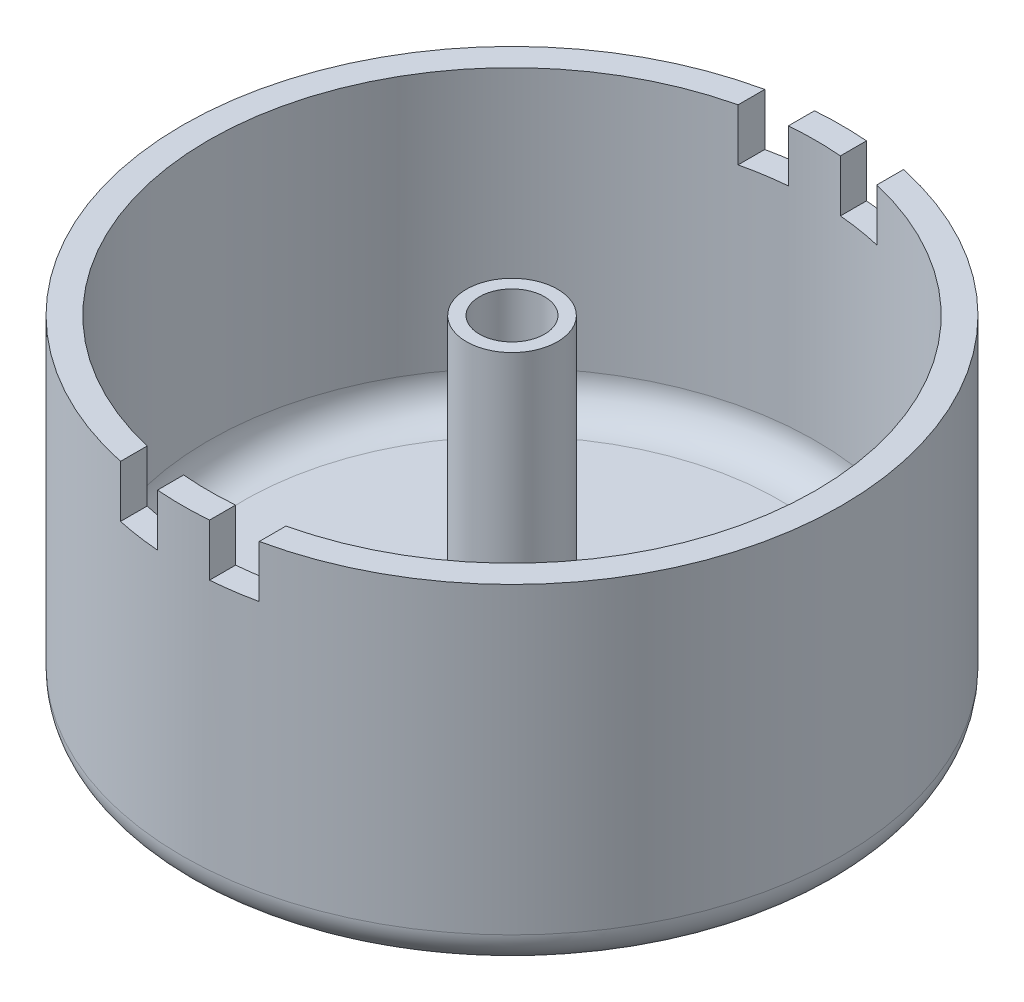
ISO-10303-21;
HEADER;
FILE_DESCRIPTION(('STEP AP214'),'2;1');
FILE_NAME('part.step','',(''),(''),'','','');
FILE_SCHEMA(('AUTOMOTIVE_DESIGN { 1 0 10303 214 1 1 1 1 }'));
ENDSEC;
DATA;
#1=APPLICATION_CONTEXT('core data for automotive mechanical design processes');
#2=APPLICATION_PROTOCOL_DEFINITION('international standard','automotive_design',2000,#1);
#3=PRODUCT_CONTEXT('',#1,'mechanical');
#4=PRODUCT('Part','Part','',(#3));
#5=PRODUCT_RELATED_PRODUCT_CATEGORY('part','',(#4));
#6=PRODUCT_DEFINITION_FORMATION('','',#4);
#7=PRODUCT_DEFINITION_CONTEXT('part definition',#1,'design');
#8=PRODUCT_DEFINITION('design','',#6,#7);
#9=PRODUCT_DEFINITION_SHAPE('','',#8);
#10=(LENGTH_UNIT() NAMED_UNIT(*) SI_UNIT(.MILLI.,.METRE.));
#11=(NAMED_UNIT(*) PLANE_ANGLE_UNIT() SI_UNIT($,.RADIAN.));
#12=(NAMED_UNIT(*) SI_UNIT($,.STERADIAN.) SOLID_ANGLE_UNIT());
#13=UNCERTAINTY_MEASURE_WITH_UNIT(LENGTH_MEASURE(1.E-05),#10,'distance_accuracy_value','');
#14=(GEOMETRIC_REPRESENTATION_CONTEXT(3) GLOBAL_UNCERTAINTY_ASSIGNED_CONTEXT((#13)) GLOBAL_UNIT_ASSIGNED_CONTEXT((#10,
#11,#12)) REPRESENTATION_CONTEXT('',''));
#15=CARTESIAN_POINT('',(0.,0.,0.));
#16=DIRECTION('',(0.,0.,1.));
#17=DIRECTION('',(1.,0.,0.));
#18=AXIS2_PLACEMENT_3D('',#15,#16,#17);
#19=CARTESIAN_POINT('',(0.,19.5,0.));
#20=DIRECTION('',(0.,1.,0.));
#21=DIRECTION('',(0.,0.,1.));
#22=AXIS2_PLACEMENT_3D('',#19,#20,#21);
#23=PLANE('',#22);
#24=CARTESIAN_POINT('',(0.,19.5,0.));
#25=DIRECTION('',(0.,1.,0.));
#26=DIRECTION('',(0.,0.,1.));
#27=AXIS2_PLACEMENT_3D('',#24,#25,#26);
#28=CIRCLE('',#27,17.5);
#29=CARTESIAN_POINT('',(-1.5,19.5,17.4355957741627));
#30=VERTEX_POINT('',#29);
#31=CARTESIAN_POINT('',(1.5,19.5,17.4355957741627));
#32=VERTEX_POINT('',#31);
#33=EDGE_CURVE('E287',#30,#32,#28,.T.);
#34=ORIENTED_EDGE('',*,*,#33,.F.);
#35=DIRECTION('',(0.,0.,1.));
#36=VECTOR('',#35,1.);
#37=CARTESIAN_POINT('',(-1.5,19.5,22.5));
#38=LINE('',#37,#36);
#39=CARTESIAN_POINT('',(-1.5,19.5,18.9406969248758));
#40=VERTEX_POINT('',#39);
#41=EDGE_CURVE('E176',#30,#40,#38,.T.);
#42=ORIENTED_EDGE('',*,*,#41,.T.);
#43=CARTESIAN_POINT('',(0.,19.5,0.));
#44=DIRECTION('',(0.,1.,0.));
#45=DIRECTION('',(0.,0.,1.));
#46=AXIS2_PLACEMENT_3D('',#43,#44,#45);
#47=CIRCLE('',#46,19.);
#48=CARTESIAN_POINT('',(1.5,19.5,18.9406969248758));
#49=VERTEX_POINT('',#48);
#50=EDGE_CURVE('E292',#40,#49,#47,.T.);
#51=ORIENTED_EDGE('',*,*,#50,.T.);
#52=DIRECTION('',(0.,0.,-1.));
#53=VECTOR('',#52,1.);
#54=CARTESIAN_POINT('',(1.5,19.5,17.4355957741627));
#55=LINE('',#54,#53);
#56=EDGE_CURVE('E191',#49,#32,#55,.T.);
#57=ORIENTED_EDGE('',*,*,#56,.T.);
#58=EDGE_LOOP('',(#34,#42,#51,#57));
#59=FACE_BOUND('',#58,.T.);
#60=ADVANCED_FACE('F45',(#59),#23,.T.);
#61=CARTESIAN_POINT('',(-4.,19.5,-18.5741756210067));
#62=VERTEX_POINT('',#61);
#63=CARTESIAN_POINT('',(-4.,19.5,18.5741756210067));
#64=VERTEX_POINT('',#63);
#65=EDGE_CURVE('E288',#62,#64,#47,.T.);
#66=ORIENTED_EDGE('',*,*,#65,.T.);
#67=DIRECTION('',(0.,0.,-1.));
#68=VECTOR('',#67,1.);
#69=CARTESIAN_POINT('',(-4.,19.5,17.0367250374008));
#70=LINE('',#69,#68);
#71=CARTESIAN_POINT('',(-4.,19.5,17.0367250374008));
#72=VERTEX_POINT('',#71);
#73=EDGE_CURVE('E204',#64,#72,#70,.T.);
#74=ORIENTED_EDGE('',*,*,#73,.T.);
#75=CARTESIAN_POINT('',(-4.,19.5,-17.0367250374008));
#76=VERTEX_POINT('',#75);
#77=EDGE_CURVE('E182',#76,#72,#28,.T.);
#78=ORIENTED_EDGE('',*,*,#77,.F.);
#79=DIRECTION('',(0.,0.,1.));
#80=VECTOR('',#79,1.);
#81=CARTESIAN_POINT('',(-4.,19.5,-17.0367250374008));
#82=LINE('',#81,#80);
#83=EDGE_CURVE('E223',#62,#76,#82,.T.);
#84=ORIENTED_EDGE('',*,*,#83,.F.);
#85=EDGE_LOOP('',(#66,#74,#78,#84));
#86=FACE_BOUND('',#85,.T.);
#87=ADVANCED_FACE('F337',(#86),#23,.T.);
#88=CARTESIAN_POINT('',(4.,19.5,17.0367250374008));
#89=VERTEX_POINT('',#88);
#90=CARTESIAN_POINT('',(4.,19.5,-17.0367250374008));
#91=VERTEX_POINT('',#90);
#92=EDGE_CURVE('E281',#89,#91,#28,.T.);
#93=ORIENTED_EDGE('',*,*,#92,.F.);
#94=DIRECTION('',(0.,0.,1.));
#95=VECTOR('',#94,1.);
#96=CARTESIAN_POINT('',(4.,19.5,22.5));
#97=LINE('',#96,#95);
#98=CARTESIAN_POINT('',(4.,19.5,18.5741756210067));
#99=VERTEX_POINT('',#98);
#100=EDGE_CURVE('E197',#89,#99,#97,.T.);
#101=ORIENTED_EDGE('',*,*,#100,.T.);
#102=CARTESIAN_POINT('',(4.,19.5,-18.5741756210067));
#103=VERTEX_POINT('',#102);
#104=EDGE_CURVE('E293',#99,#103,#47,.T.);
#105=ORIENTED_EDGE('',*,*,#104,.T.);
#106=DIRECTION('',(0.,0.,-1.));
#107=VECTOR('',#106,1.);
#108=CARTESIAN_POINT('',(4.,19.5,-22.5));
#109=LINE('',#108,#107);
#110=EDGE_CURVE('E242',#91,#103,#109,.T.);
#111=ORIENTED_EDGE('',*,*,#110,.F.);
#112=EDGE_LOOP('',(#93,#101,#105,#111));
#113=FACE_BOUND('',#112,.T.);
#114=ADVANCED_FACE('F344',(#113),#23,.T.);
#115=CARTESIAN_POINT('',(0.,2.5,0.));
#116=DIRECTION('',(0.,-1.,0.));
#117=DIRECTION('',(0.,0.,-1.));
#118=AXIS2_PLACEMENT_3D('',#115,#116,#117);
#119=CYLINDRICAL_SURFACE('',#118,19.);
#120=CARTESIAN_POINT('',(0.,2.,0.));
#121=DIRECTION('',(0.,1.,0.));
#122=DIRECTION('',(0.,0.,1.));
#123=AXIS2_PLACEMENT_3D('',#120,#121,#122);
#124=CIRCLE('',#123,19.);
#125=CARTESIAN_POINT('',(0.,2.,19.));
#126=VERTEX_POINT('',#125);
#127=EDGE_CURVE('E294',#126,#126,#124,.T.);
#128=ORIENTED_EDGE('',*,*,#127,.T.);
#129=EDGE_LOOP('',(#128));
#130=FACE_BOUND('',#129,.T.);
#131=DIRECTION('',(0.,-1.,0.));
#132=VECTOR('',#131,1.);
#133=CARTESIAN_POINT('',(-1.5,2.5,18.9406969248758));
#134=LINE('',#133,#132);
#135=CARTESIAN_POINT('',(-1.5,16.5,18.9406969248758));
#136=VERTEX_POINT('',#135);
#137=EDGE_CURVE('E216',#136,#40,#134,.F.);
#138=ORIENTED_EDGE('',*,*,#137,.F.);
#139=CARTESIAN_POINT('',(0.,16.5,0.));
#140=DIRECTION('',(0.,-1.,0.));
#141=DIRECTION('',(0.,0.,-1.));
#142=AXIS2_PLACEMENT_3D('',#139,#140,#141);
#143=CIRCLE('',#142,19.);
#144=CARTESIAN_POINT('',(-4.,16.5,18.5741756210067));
#145=VERTEX_POINT('',#144);
#146=EDGE_CURVE('E213',#136,#145,#143,.T.);
#147=ORIENTED_EDGE('',*,*,#146,.T.);
#148=DIRECTION('',(0.,-1.,0.));
#149=VECTOR('',#148,1.);
#150=CARTESIAN_POINT('',(-4.,2.5,18.5741756210067));
#151=LINE('',#150,#149);
#152=EDGE_CURVE('E167',#64,#145,#151,.T.);
#153=ORIENTED_EDGE('',*,*,#152,.F.);
#154=ORIENTED_EDGE('',*,*,#65,.F.);
#155=DIRECTION('',(0.,-1.,0.));
#156=VECTOR('',#155,1.);
#157=CARTESIAN_POINT('',(-4.,2.5,-18.5741756210067));
#158=LINE('',#157,#156);
#159=CARTESIAN_POINT('',(-4.,16.5,-18.5741756210067));
#160=VERTEX_POINT('',#159);
#161=EDGE_CURVE('E269',#62,#160,#158,.T.);
#162=ORIENTED_EDGE('',*,*,#161,.T.);
#163=CARTESIAN_POINT('',(0.,16.5,0.));
#164=DIRECTION('',(0.,-1.,0.));
#165=DIRECTION('',(0.,0.,-1.));
#166=AXIS2_PLACEMENT_3D('',#163,#164,#165);
#167=CIRCLE('',#166,19.);
#168=CARTESIAN_POINT('',(-1.5,16.5,-18.9406969248758));
#169=VERTEX_POINT('',#168);
#170=EDGE_CURVE('E263',#160,#169,#167,.T.);
#171=ORIENTED_EDGE('',*,*,#170,.T.);
#172=DIRECTION('',(0.,-1.,0.));
#173=VECTOR('',#172,1.);
#174=CARTESIAN_POINT('',(-1.5,2.5,-18.9406969248758));
#175=LINE('',#174,#173);
#176=CARTESIAN_POINT('',(-1.5,19.5,-18.9406969248758));
#177=VERTEX_POINT('',#176);
#178=EDGE_CURVE('E266',#169,#177,#175,.F.);
#179=ORIENTED_EDGE('',*,*,#178,.T.);
#180=CARTESIAN_POINT('',(1.5,19.5,-18.9406969248758));
#181=VERTEX_POINT('',#180);
#182=EDGE_CURVE('E291',#181,#177,#47,.T.);
#183=ORIENTED_EDGE('',*,*,#182,.F.);
#184=DIRECTION('',(0.,-1.,0.));
#185=VECTOR('',#184,1.);
#186=CARTESIAN_POINT('',(1.5,2.5,-18.9406969248758));
#187=LINE('',#186,#185);
#188=CARTESIAN_POINT('',(1.5,16.5,-18.9406969248758));
#189=VERTEX_POINT('',#188);
#190=EDGE_CURVE('E257',#181,#189,#187,.T.);
#191=ORIENTED_EDGE('',*,*,#190,.T.);
#192=CARTESIAN_POINT('',(0.,16.5,0.));
#193=DIRECTION('',(0.,-1.,0.));
#194=DIRECTION('',(0.,0.,-1.));
#195=AXIS2_PLACEMENT_3D('',#192,#193,#194);
#196=CIRCLE('',#195,19.);
#197=CARTESIAN_POINT('',(4.,16.5,-18.5741756210067));
#198=VERTEX_POINT('',#197);
#199=EDGE_CURVE('E236',#189,#198,#196,.T.);
#200=ORIENTED_EDGE('',*,*,#199,.T.);
#201=DIRECTION('',(0.,-1.,0.));
#202=VECTOR('',#201,1.);
#203=CARTESIAN_POINT('',(4.,2.5,-18.5741756210067));
#204=LINE('',#203,#202);
#205=EDGE_CURVE('E260',#198,#103,#204,.F.);
#206=ORIENTED_EDGE('',*,*,#205,.T.);
#207=ORIENTED_EDGE('',*,*,#104,.F.);
#208=DIRECTION('',(0.,-1.,0.));
#209=VECTOR('',#208,1.);
#210=CARTESIAN_POINT('',(4.,2.5,18.5741756210067));
#211=LINE('',#210,#209);
#212=CARTESIAN_POINT('',(4.,16.5,18.5741756210067));
#213=VERTEX_POINT('',#212);
#214=EDGE_CURVE('E209',#213,#99,#211,.F.);
#215=ORIENTED_EDGE('',*,*,#214,.F.);
#216=CARTESIAN_POINT('',(0.,16.5,0.));
#217=DIRECTION('',(0.,-1.,0.));
#218=DIRECTION('',(0.,0.,-1.));
#219=AXIS2_PLACEMENT_3D('',#216,#217,#218);
#220=CIRCLE('',#219,19.);
#221=CARTESIAN_POINT('',(1.5,16.5,18.9406969248758));
#222=VERTEX_POINT('',#221);
#223=EDGE_CURVE('E184',#213,#222,#220,.T.);
#224=ORIENTED_EDGE('',*,*,#223,.T.);
#225=DIRECTION('',(0.,-1.,0.));
#226=VECTOR('',#225,1.);
#227=CARTESIAN_POINT('',(1.5,2.5,18.9406969248758));
#228=LINE('',#227,#226);
#229=EDGE_CURVE('E211',#49,#222,#228,.T.);
#230=ORIENTED_EDGE('',*,*,#229,.F.);
#231=ORIENTED_EDGE('',*,*,#50,.F.);
#232=EDGE_LOOP('',(#138,#147,#153,#154,#162,#171,#179,#183,#191,#200,#206,#207,#215,#224,#230,#231));
#233=FACE_BOUND('',#232,.T.);
#234=ADVANCED_FACE('F361',(#130,#233),#119,.T.);
#235=CARTESIAN_POINT('',(0.,19.5,0.));
#236=DIRECTION('',(0.,-1.,0.));
#237=DIRECTION('',(0.,0.,-1.));
#238=AXIS2_PLACEMENT_3D('',#235,#236,#237);
#239=CYLINDRICAL_SURFACE('',#238,17.5);
#240=CARTESIAN_POINT('',(0.,4.5,0.));
#241=DIRECTION('',(0.,1.,0.));
#242=DIRECTION('',(0.,0.,1.));
#243=AXIS2_PLACEMENT_3D('',#240,#241,#242);
#244=CIRCLE('',#243,17.5);
#245=CARTESIAN_POINT('',(0.,4.5,17.5));
#246=VERTEX_POINT('',#245);
#247=EDGE_CURVE('E12',#246,#246,#244,.F.);
#248=ORIENTED_EDGE('',*,*,#247,.T.);
#249=EDGE_LOOP('',(#248));
#250=FACE_BOUND('',#249,.T.);
#251=CARTESIAN_POINT('',(0.,16.5,0.));
#252=DIRECTION('',(0.,1.,0.));
#253=DIRECTION('',(0.,0.,1.));
#254=AXIS2_PLACEMENT_3D('',#251,#252,#253);
#255=CIRCLE('',#254,17.5);
#256=CARTESIAN_POINT('',(-4.,16.5,17.0367250374008));
#257=VERTEX_POINT('',#256);
#258=CARTESIAN_POINT('',(-1.5,16.5,17.4355957741627));
#259=VERTEX_POINT('',#258);
#260=EDGE_CURVE('E171',#257,#259,#255,.T.);
#261=ORIENTED_EDGE('',*,*,#260,.T.);
#262=DIRECTION('',(0.,1.,0.));
#263=VECTOR('',#262,1.);
#264=CARTESIAN_POINT('',(-1.5,16.5,17.4355957741627));
#265=LINE('',#264,#263);
#266=EDGE_CURVE('E61',#259,#30,#265,.T.);
#267=ORIENTED_EDGE('',*,*,#266,.T.);
#268=ORIENTED_EDGE('',*,*,#33,.T.);
#269=DIRECTION('',(0.,1.,0.));
#270=VECTOR('',#269,1.);
#271=CARTESIAN_POINT('',(1.5,16.5,17.4355957741627));
#272=LINE('',#271,#270);
#273=CARTESIAN_POINT('',(1.5,16.5,17.4355957741627));
#274=VERTEX_POINT('',#273);
#275=EDGE_CURVE('E202',#274,#32,#272,.T.);
#276=ORIENTED_EDGE('',*,*,#275,.F.);
#277=CARTESIAN_POINT('',(0.,16.5,0.));
#278=DIRECTION('',(0.,1.,0.));
#279=DIRECTION('',(0.,0.,1.));
#280=AXIS2_PLACEMENT_3D('',#277,#278,#279);
#281=CIRCLE('',#280,17.5);
#282=CARTESIAN_POINT('',(4.,16.5,17.0367250374008));
#283=VERTEX_POINT('',#282);
#284=EDGE_CURVE('E190',#274,#283,#281,.T.);
#285=ORIENTED_EDGE('',*,*,#284,.T.);
#286=DIRECTION('',(0.,1.,0.));
#287=VECTOR('',#286,1.);
#288=CARTESIAN_POINT('',(4.,16.5,17.0367250374008));
#289=LINE('',#288,#287);
#290=EDGE_CURVE('E196',#283,#89,#289,.T.);
#291=ORIENTED_EDGE('',*,*,#290,.T.);
#292=ORIENTED_EDGE('',*,*,#92,.T.);
#293=DIRECTION('',(0.,1.,0.));
#294=VECTOR('',#293,1.);
#295=CARTESIAN_POINT('',(4.,16.5,-17.0367250374008));
#296=LINE('',#295,#294);
#297=CARTESIAN_POINT('',(4.,16.5,-17.0367250374008));
#298=VERTEX_POINT('',#297);
#299=EDGE_CURVE('E232',#298,#91,#296,.T.);
#300=ORIENTED_EDGE('',*,*,#299,.F.);
#301=CARTESIAN_POINT('',(0.,16.5,0.));
#302=DIRECTION('',(0.,-1.,0.));
#303=DIRECTION('',(0.,0.,-1.));
#304=AXIS2_PLACEMENT_3D('',#301,#302,#303);
#305=CIRCLE('',#304,17.5);
#306=CARTESIAN_POINT('',(1.5,16.5,-17.4355957741627));
#307=VERTEX_POINT('',#306);
#308=EDGE_CURVE('E241',#307,#298,#305,.T.);
#309=ORIENTED_EDGE('',*,*,#308,.F.);
#310=DIRECTION('',(0.,1.,0.));
#311=VECTOR('',#310,1.);
#312=CARTESIAN_POINT('',(1.5,16.5,-17.4355957741627));
#313=LINE('',#312,#311);
#314=CARTESIAN_POINT('',(1.5,19.5,-17.4355957741627));
#315=VERTEX_POINT('',#314);
#316=EDGE_CURVE('E247',#307,#315,#313,.T.);
#317=ORIENTED_EDGE('',*,*,#316,.T.);
#318=CARTESIAN_POINT('',(-1.5,19.5,-17.4355957741627));
#319=VERTEX_POINT('',#318);
#320=EDGE_CURVE('E286',#315,#319,#28,.T.);
#321=ORIENTED_EDGE('',*,*,#320,.T.);
#322=DIRECTION('',(0.,1.,0.));
#323=VECTOR('',#322,1.);
#324=CARTESIAN_POINT('',(-1.5,16.5,-17.4355957741627));
#325=LINE('',#324,#323);
#326=CARTESIAN_POINT('',(-1.5,16.5,-17.4355957741627));
#327=VERTEX_POINT('',#326);
#328=EDGE_CURVE('E229',#327,#319,#325,.T.);
#329=ORIENTED_EDGE('',*,*,#328,.F.);
#330=CARTESIAN_POINT('',(0.,16.5,0.));
#331=DIRECTION('',(0.,-1.,0.));
#332=DIRECTION('',(0.,0.,-1.));
#333=AXIS2_PLACEMENT_3D('',#330,#331,#332);
#334=CIRCLE('',#333,17.5);
#335=CARTESIAN_POINT('',(-4.,16.5,-17.0367250374008));
#336=VERTEX_POINT('',#335);
#337=EDGE_CURVE('E219',#336,#327,#334,.T.);
#338=ORIENTED_EDGE('',*,*,#337,.F.);
#339=DIRECTION('',(0.,1.,0.));
#340=VECTOR('',#339,1.);
#341=CARTESIAN_POINT('',(-4.,16.5,-17.0367250374008));
#342=LINE('',#341,#340);
#343=EDGE_CURVE('E234',#336,#76,#342,.T.);
#344=ORIENTED_EDGE('',*,*,#343,.T.);
#345=ORIENTED_EDGE('',*,*,#77,.T.);
#346=DIRECTION('',(0.,1.,0.));
#347=VECTOR('',#346,1.);
#348=CARTESIAN_POINT('',(-4.,16.5,17.0367250374008));
#349=LINE('',#348,#347);
#350=EDGE_CURVE('E164',#257,#72,#349,.T.);
#351=ORIENTED_EDGE('',*,*,#350,.F.);
#352=EDGE_LOOP('',(#261,#267,#268,#276,#285,#291,#292,#300,#309,#317,#321,#329,#338,#344,#345,#351));
#353=FACE_BOUND('',#352,.T.);
#354=ADVANCED_FACE('F179',(#250,#353),#239,.F.);
#355=CARTESIAN_POINT('',(0.,26.9246212024588,0.));
#356=DIRECTION('',(0.,-1.,0.));
#357=DIRECTION('',(0.,0.,-1.));
#358=AXIS2_PLACEMENT_3D('',#355,#356,#357);
#359=CYLINDRICAL_SURFACE('',#358,1.875);
#360=CARTESIAN_POINT('',(0.,19.5,0.));
#361=DIRECTION('',(0.,1.,0.));
#362=DIRECTION('',(0.,0.,1.));
#363=AXIS2_PLACEMENT_3D('',#360,#361,#362);
#364=CIRCLE('',#363,1.875);
#365=CARTESIAN_POINT('',(0.,19.5,1.875));
#366=VERTEX_POINT('',#365);
#367=EDGE_CURVE('E282',#366,#366,#364,.T.);
#368=ORIENTED_EDGE('',*,*,#367,.T.);
#369=EDGE_LOOP('',(#368));
#370=FACE_BOUND('',#369,.T.);
#371=CARTESIAN_POINT('',(0.,2.5,0.));
#372=DIRECTION('',(0.,-1.,0.));
#373=DIRECTION('',(0.,0.,-1.));
#374=AXIS2_PLACEMENT_3D('',#371,#372,#373);
#375=CIRCLE('',#374,1.875);
#376=CARTESIAN_POINT('',(0.,2.5,-1.875));
#377=VERTEX_POINT('',#376);
#378=EDGE_CURVE('E49',#377,#377,#375,.T.);
#379=ORIENTED_EDGE('',*,*,#378,.T.);
#380=EDGE_LOOP('',(#379));
#381=FACE_BOUND('',#380,.T.);
#382=ADVANCED_FACE('F356',(#370,#381),#359,.F.);
#383=CARTESIAN_POINT('',(0.,0.,0.));
#384=DIRECTION('',(0.,1.,0.));
#385=DIRECTION('',(0.,0.,1.));
#386=AXIS2_PLACEMENT_3D('',#383,#384,#385);
#387=PLANE('',#386);
#388=CARTESIAN_POINT('',(0.,0.,0.));
#389=DIRECTION('',(0.,-1.,0.));
#390=DIRECTION('',(0.,0.,-1.));
#391=AXIS2_PLACEMENT_3D('',#388,#389,#390);
#392=CIRCLE('',#391,3.25);
#393=CARTESIAN_POINT('',(0.,0.,-3.25));
#394=VERTEX_POINT('',#393);
#395=EDGE_CURVE('E272',#394,#394,#392,.T.);
#396=ORIENTED_EDGE('',*,*,#395,.F.);
#397=EDGE_LOOP('',(#396));
#398=FACE_BOUND('',#397,.T.);
#399=CARTESIAN_POINT('',(0.,0.,0.));
#400=DIRECTION('',(0.,1.,0.));
#401=DIRECTION('',(0.,0.,1.));
#402=AXIS2_PLACEMENT_3D('',#399,#400,#401);
#403=CIRCLE('',#402,17.);
#404=CARTESIAN_POINT('',(0.,0.,17.));
#405=VERTEX_POINT('',#404);
#406=EDGE_CURVE('E297',#405,#405,#403,.F.);
#407=ORIENTED_EDGE('',*,*,#406,.T.);
#408=EDGE_LOOP('',(#407));
#409=FACE_BOUND('',#408,.T.);
#410=ADVANCED_FACE('F350',(#398,#409),#387,.F.);
#411=DIRECTION('',(0.,0.,-1.));
#412=VECTOR('',#411,1.);
#413=CARTESIAN_POINT('',(-1.5,19.5,-22.5));
#414=LINE('',#413,#412);
#415=EDGE_CURVE('E230',#319,#177,#414,.T.);
#416=ORIENTED_EDGE('',*,*,#415,.F.);
#417=ORIENTED_EDGE('',*,*,#320,.F.);
#418=DIRECTION('',(0.,0.,1.));
#419=VECTOR('',#418,1.);
#420=CARTESIAN_POINT('',(1.5,19.5,-17.4355957741627));
#421=LINE('',#420,#419);
#422=EDGE_CURVE('E218',#181,#315,#421,.T.);
#423=ORIENTED_EDGE('',*,*,#422,.F.);
#424=ORIENTED_EDGE('',*,*,#182,.T.);
#425=EDGE_LOOP('',(#416,#417,#423,#424));
#426=FACE_BOUND('',#425,.T.);
#427=ADVANCED_FACE('F340',(#426),#23,.T.);
#428=CARTESIAN_POINT('',(0.,2.5,0.));
#429=DIRECTION('',(0.,1.,0.));
#430=DIRECTION('',(0.,0.,1.));
#431=AXIS2_PLACEMENT_3D('',#428,#429,#430);
#432=PLANE('',#431);
#433=CARTESIAN_POINT('',(0.,2.5,0.));
#434=DIRECTION('',(0.,1.,0.));
#435=DIRECTION('',(0.,0.,1.));
#436=AXIS2_PLACEMENT_3D('',#433,#434,#435);
#437=CIRCLE('',#436,4.625);
#438=CARTESIAN_POINT('',(0.,2.5,4.625));
#439=VERTEX_POINT('',#438);
#440=EDGE_CURVE('E54',#439,#439,#437,.F.);
#441=ORIENTED_EDGE('',*,*,#440,.T.);
#442=EDGE_LOOP('',(#441));
#443=FACE_BOUND('',#442,.T.);
#444=CARTESIAN_POINT('',(0.,2.5,0.));
#445=DIRECTION('',(0.,1.,0.));
#446=DIRECTION('',(0.,0.,1.));
#447=AXIS2_PLACEMENT_3D('',#444,#445,#446);
#448=CIRCLE('',#447,15.5);
#449=CARTESIAN_POINT('',(0.,2.5,15.5));
#450=VERTEX_POINT('',#449);
#451=EDGE_CURVE('E303',#450,#450,#448,.T.);
#452=ORIENTED_EDGE('',*,*,#451,.T.);
#453=EDGE_LOOP('',(#452));
#454=FACE_BOUND('',#453,.T.);
#455=ADVANCED_FACE('F309',(#443,#454),#432,.T.);
#456=CARTESIAN_POINT('',(0.,26.9246212024588,0.));
#457=DIRECTION('',(0.,-1.,0.));
#458=DIRECTION('',(0.,0.,-1.));
#459=AXIS2_PLACEMENT_3D('',#456,#457,#458);
#460=CYLINDRICAL_SURFACE('',#459,2.625);
#461=CARTESIAN_POINT('',(0.,4.5,0.));
#462=DIRECTION('',(0.,1.,0.));
#463=DIRECTION('',(0.,0.,1.));
#464=AXIS2_PLACEMENT_3D('',#461,#462,#463);
#465=CIRCLE('',#464,2.625);
#466=CARTESIAN_POINT('',(0.,4.5,2.625));
#467=VERTEX_POINT('',#466);
#468=EDGE_CURVE('E300',#467,#467,#465,.T.);
#469=ORIENTED_EDGE('',*,*,#468,.T.);
#470=EDGE_LOOP('',(#469));
#471=FACE_BOUND('',#470,.T.);
#472=CARTESIAN_POINT('',(0.,19.5,0.));
#473=DIRECTION('',(0.,1.,0.));
#474=DIRECTION('',(0.,0.,1.));
#475=AXIS2_PLACEMENT_3D('',#472,#473,#474);
#476=CIRCLE('',#475,2.625);
#477=CARTESIAN_POINT('',(0.,19.5,2.625));
#478=VERTEX_POINT('',#477);
#479=EDGE_CURVE('E278',#478,#478,#476,.T.);
#480=ORIENTED_EDGE('',*,*,#479,.F.);
#481=EDGE_LOOP('',(#480));
#482=FACE_BOUND('',#481,.T.);
#483=ADVANCED_FACE('F318',(#471,#482),#460,.T.);
#484=CARTESIAN_POINT('',(0.,19.5,0.));
#485=DIRECTION('',(0.,1.,0.));
#486=DIRECTION('',(0.,0.,1.));
#487=AXIS2_PLACEMENT_3D('',#484,#485,#486);
#488=PLANE('',#487);
#489=ORIENTED_EDGE('',*,*,#367,.F.);
#490=EDGE_LOOP('',(#489));
#491=FACE_BOUND('',#490,.T.);
#492=ORIENTED_EDGE('',*,*,#479,.T.);
#493=EDGE_LOOP('',(#492));
#494=FACE_BOUND('',#493,.T.);
#495=ADVANCED_FACE('F321',(#491,#494),#488,.T.);
#496=CARTESIAN_POINT('',(0.,2.,0.));
#497=DIRECTION('',(0.,1.,0.));
#498=DIRECTION('',(0.,0.,1.));
#499=AXIS2_PLACEMENT_3D('',#496,#497,#498);
#500=TOROIDAL_SURFACE('',#499,17.,2.);
#501=ORIENTED_EDGE('',*,*,#406,.F.);
#502=EDGE_LOOP('',(#501));
#503=FACE_BOUND('',#502,.T.);
#504=ORIENTED_EDGE('',*,*,#127,.F.);
#505=EDGE_LOOP('',(#504));
#506=FACE_BOUND('',#505,.T.);
#507=ADVANCED_FACE('F315',(#503,#506),#500,.T.);
#508=CARTESIAN_POINT('',(0.,4.5,0.));
#509=DIRECTION('',(0.,1.,0.));
#510=DIRECTION('',(0.,0.,1.));
#511=AXIS2_PLACEMENT_3D('',#508,#509,#510);
#512=TOROIDAL_SURFACE('',#511,4.625,2.);
#513=ORIENTED_EDGE('',*,*,#440,.F.);
#514=EDGE_LOOP('',(#513));
#515=FACE_BOUND('',#514,.T.);
#516=ORIENTED_EDGE('',*,*,#468,.F.);
#517=EDGE_LOOP('',(#516));
#518=FACE_BOUND('',#517,.T.);
#519=ADVANCED_FACE('F312',(#515,#518),#512,.F.);
#520=CARTESIAN_POINT('',(0.,4.5,0.));
#521=DIRECTION('',(0.,1.,0.));
#522=DIRECTION('',(0.,0.,1.));
#523=AXIS2_PLACEMENT_3D('',#520,#521,#522);
#524=TOROIDAL_SURFACE('',#523,15.5,2.);
#525=ORIENTED_EDGE('',*,*,#451,.F.);
#526=EDGE_LOOP('',(#525));
#527=FACE_BOUND('',#526,.T.);
#528=ORIENTED_EDGE('',*,*,#247,.F.);
#529=EDGE_LOOP('',(#528));
#530=FACE_BOUND('',#529,.T.);
#531=ADVANCED_FACE('F47',(#527,#530),#524,.F.);
#532=CARTESIAN_POINT('',(0.,2.5,0.));
#533=DIRECTION('',(0.,-1.,0.));
#534=DIRECTION('',(0.,0.,-1.));
#535=AXIS2_PLACEMENT_3D('',#532,#533,#534);
#536=CYLINDRICAL_SURFACE('',#535,3.25);
#537=CARTESIAN_POINT('',(0.,2.5,0.));
#538=DIRECTION('',(0.,-1.,0.));
#539=DIRECTION('',(0.,0.,-1.));
#540=AXIS2_PLACEMENT_3D('',#537,#538,#539);
#541=CIRCLE('',#540,3.25);
#542=CARTESIAN_POINT('',(0.,2.5,-3.25));
#543=VERTEX_POINT('',#542);
#544=EDGE_CURVE('E273',#543,#543,#541,.T.);
#545=ORIENTED_EDGE('',*,*,#544,.F.);
#546=EDGE_LOOP('',(#545));
#547=FACE_BOUND('',#546,.T.);
#548=ORIENTED_EDGE('',*,*,#395,.T.);
#549=EDGE_LOOP('',(#548));
#550=FACE_BOUND('',#549,.T.);
#551=ADVANCED_FACE('F424',(#547,#550),#536,.F.);
#552=CARTESIAN_POINT('',(0.,2.5,0.));
#553=DIRECTION('',(0.,-1.,0.));
#554=DIRECTION('',(0.,0.,-1.));
#555=AXIS2_PLACEMENT_3D('',#552,#553,#554);
#556=PLANE('',#555);
#557=ORIENTED_EDGE('',*,*,#378,.F.);
#558=EDGE_LOOP('',(#557));
#559=FACE_BOUND('',#558,.T.);
#560=ORIENTED_EDGE('',*,*,#544,.T.);
#561=EDGE_LOOP('',(#560));
#562=FACE_BOUND('',#561,.T.);
#563=ADVANCED_FACE('F420',(#559,#562),#556,.T.);
#564=CARTESIAN_POINT('',(4.,16.5,-22.5));
#565=DIRECTION('',(1.,0.,0.));
#566=DIRECTION('',(0.,0.,-1.));
#567=AXIS2_PLACEMENT_3D('',#564,#565,#566);
#568=PLANE('',#567);
#569=DIRECTION('',(0.,0.,-1.));
#570=VECTOR('',#569,1.);
#571=CARTESIAN_POINT('',(4.,16.5,-22.5));
#572=LINE('',#571,#570);
#573=EDGE_CURVE('E244',#298,#198,#572,.T.);
#574=ORIENTED_EDGE('',*,*,#573,.F.);
#575=ORIENTED_EDGE('',*,*,#299,.T.);
#576=ORIENTED_EDGE('',*,*,#110,.T.);
#577=ORIENTED_EDGE('',*,*,#205,.F.);
#578=EDGE_LOOP('',(#574,#575,#576,#577));
#579=FACE_BOUND('',#578,.T.);
#580=ADVANCED_FACE('F405',(#579),#568,.F.);
#581=CARTESIAN_POINT('',(1.5,16.5,-17.4355957741627));
#582=DIRECTION('',(-1.,0.,0.));
#583=DIRECTION('',(0.,0.,1.));
#584=AXIS2_PLACEMENT_3D('',#581,#582,#583);
#585=PLANE('',#584);
#586=ORIENTED_EDGE('',*,*,#422,.T.);
#587=ORIENTED_EDGE('',*,*,#316,.F.);
#588=DIRECTION('',(0.,0.,1.));
#589=VECTOR('',#588,1.);
#590=CARTESIAN_POINT('',(1.5,16.5,-17.4355957741627));
#591=LINE('',#590,#589);
#592=EDGE_CURVE('E238',#189,#307,#591,.T.);
#593=ORIENTED_EDGE('',*,*,#592,.F.);
#594=ORIENTED_EDGE('',*,*,#190,.F.);
#595=EDGE_LOOP('',(#586,#587,#593,#594));
#596=FACE_BOUND('',#595,.T.);
#597=ADVANCED_FACE('F411',(#596),#585,.F.);
#598=CARTESIAN_POINT('',(0.,16.5,0.));
#599=DIRECTION('',(0.,-1.,0.));
#600=DIRECTION('',(0.,0.,-1.));
#601=AXIS2_PLACEMENT_3D('',#598,#599,#600);
#602=PLANE('',#601);
#603=ORIENTED_EDGE('',*,*,#592,.T.);
#604=ORIENTED_EDGE('',*,*,#308,.T.);
#605=ORIENTED_EDGE('',*,*,#573,.T.);
#606=ORIENTED_EDGE('',*,*,#199,.F.);
#607=EDGE_LOOP('',(#603,#604,#605,#606));
#608=FACE_BOUND('',#607,.T.);
#609=ADVANCED_FACE('F407',(#608),#602,.F.);
#610=CARTESIAN_POINT('',(-4.,16.5,-17.0367250374008));
#611=DIRECTION('',(-1.,0.,0.));
#612=DIRECTION('',(0.,0.,1.));
#613=AXIS2_PLACEMENT_3D('',#610,#611,#612);
#614=PLANE('',#613);
#615=ORIENTED_EDGE('',*,*,#83,.T.);
#616=ORIENTED_EDGE('',*,*,#343,.F.);
#617=DIRECTION('',(0.,0.,1.));
#618=VECTOR('',#617,1.);
#619=CARTESIAN_POINT('',(-4.,16.5,-17.0367250374008));
#620=LINE('',#619,#618);
#621=EDGE_CURVE('E226',#160,#336,#620,.T.);
#622=ORIENTED_EDGE('',*,*,#621,.F.);
#623=ORIENTED_EDGE('',*,*,#161,.F.);
#624=EDGE_LOOP('',(#615,#616,#622,#623));
#625=FACE_BOUND('',#624,.T.);
#626=ADVANCED_FACE('F418',(#625),#614,.F.);
#627=CARTESIAN_POINT('',(-1.5,16.5,-22.5));
#628=DIRECTION('',(1.,0.,0.));
#629=DIRECTION('',(0.,0.,-1.));
#630=AXIS2_PLACEMENT_3D('',#627,#628,#629);
#631=PLANE('',#630);
#632=DIRECTION('',(0.,0.,-1.));
#633=VECTOR('',#632,1.);
#634=CARTESIAN_POINT('',(-1.5,16.5,-22.5));
#635=LINE('',#634,#633);
#636=EDGE_CURVE('E222',#327,#169,#635,.T.);
#637=ORIENTED_EDGE('',*,*,#636,.F.);
#638=ORIENTED_EDGE('',*,*,#328,.T.);
#639=ORIENTED_EDGE('',*,*,#415,.T.);
#640=ORIENTED_EDGE('',*,*,#178,.F.);
#641=EDGE_LOOP('',(#637,#638,#639,#640));
#642=FACE_BOUND('',#641,.T.);
#643=ADVANCED_FACE('F386',(#642),#631,.F.);
#644=CARTESIAN_POINT('',(0.,16.5,0.));
#645=DIRECTION('',(0.,-1.,0.));
#646=DIRECTION('',(0.,0.,-1.));
#647=AXIS2_PLACEMENT_3D('',#644,#645,#646);
#648=PLANE('',#647);
#649=ORIENTED_EDGE('',*,*,#621,.T.);
#650=ORIENTED_EDGE('',*,*,#337,.T.);
#651=ORIENTED_EDGE('',*,*,#636,.T.);
#652=ORIENTED_EDGE('',*,*,#170,.F.);
#653=EDGE_LOOP('',(#649,#650,#651,#652));
#654=FACE_BOUND('',#653,.T.);
#655=ADVANCED_FACE('F388',(#654),#648,.F.);
#656=CARTESIAN_POINT('',(1.5,16.5,17.4355957741627));
#657=DIRECTION('',(1.,0.,0.));
#658=DIRECTION('',(0.,0.,-1.));
#659=AXIS2_PLACEMENT_3D('',#656,#657,#658);
#660=PLANE('',#659);
#661=ORIENTED_EDGE('',*,*,#229,.T.);
#662=DIRECTION('',(0.,0.,-1.));
#663=VECTOR('',#662,1.);
#664=CARTESIAN_POINT('',(1.5,16.5,17.4355957741627));
#665=LINE('',#664,#663);
#666=EDGE_CURVE('E194',#222,#274,#665,.T.);
#667=ORIENTED_EDGE('',*,*,#666,.T.);
#668=ORIENTED_EDGE('',*,*,#275,.T.);
#669=ORIENTED_EDGE('',*,*,#56,.F.);
#670=EDGE_LOOP('',(#661,#667,#668,#669));
#671=FACE_BOUND('',#670,.T.);
#672=ADVANCED_FACE('F399',(#671),#660,.T.);
#673=CARTESIAN_POINT('',(4.,16.5,22.5));
#674=DIRECTION('',(-1.,0.,0.));
#675=DIRECTION('',(0.,0.,1.));
#676=AXIS2_PLACEMENT_3D('',#673,#674,#675);
#677=PLANE('',#676);
#678=ORIENTED_EDGE('',*,*,#214,.T.);
#679=ORIENTED_EDGE('',*,*,#100,.F.);
#680=ORIENTED_EDGE('',*,*,#290,.F.);
#681=DIRECTION('',(0.,0.,1.));
#682=VECTOR('',#681,1.);
#683=CARTESIAN_POINT('',(4.,16.5,22.5));
#684=LINE('',#683,#682);
#685=EDGE_CURVE('E69',#283,#213,#684,.T.);
#686=ORIENTED_EDGE('',*,*,#685,.T.);
#687=EDGE_LOOP('',(#678,#679,#680,#686));
#688=FACE_BOUND('',#687,.T.);
#689=ADVANCED_FACE('F402',(#688),#677,.T.);
#690=CARTESIAN_POINT('',(0.,16.5,0.));
#691=DIRECTION('',(0.,-1.,0.));
#692=DIRECTION('',(0.,0.,1.));
#693=AXIS2_PLACEMENT_3D('',#690,#691,#692);
#694=PLANE('',#693);
#695=ORIENTED_EDGE('',*,*,#685,.F.);
#696=ORIENTED_EDGE('',*,*,#284,.F.);
#697=ORIENTED_EDGE('',*,*,#666,.F.);
#698=ORIENTED_EDGE('',*,*,#223,.F.);
#699=EDGE_LOOP('',(#695,#696,#697,#698));
#700=FACE_BOUND('',#699,.T.);
#701=ADVANCED_FACE('F400',(#700),#694,.F.);
#702=CARTESIAN_POINT('',(-1.5,16.5,22.5));
#703=DIRECTION('',(-1.,0.,0.));
#704=DIRECTION('',(0.,0.,1.));
#705=AXIS2_PLACEMENT_3D('',#702,#703,#704);
#706=PLANE('',#705);
#707=ORIENTED_EDGE('',*,*,#137,.T.);
#708=ORIENTED_EDGE('',*,*,#41,.F.);
#709=ORIENTED_EDGE('',*,*,#266,.F.);
#710=DIRECTION('',(0.,0.,1.));
#711=VECTOR('',#710,1.);
#712=CARTESIAN_POINT('',(-1.5,16.5,22.5));
#713=LINE('',#712,#711);
#714=EDGE_CURVE('E170',#259,#136,#713,.T.);
#715=ORIENTED_EDGE('',*,*,#714,.T.);
#716=EDGE_LOOP('',(#707,#708,#709,#715));
#717=FACE_BOUND('',#716,.T.);
#718=ADVANCED_FACE('F566',(#717),#706,.T.);
#719=CARTESIAN_POINT('',(-4.,16.5,17.0367250374008));
#720=DIRECTION('',(1.,0.,0.));
#721=DIRECTION('',(0.,0.,-1.));
#722=AXIS2_PLACEMENT_3D('',#719,#720,#721);
#723=PLANE('',#722);
#724=ORIENTED_EDGE('',*,*,#152,.T.);
#725=DIRECTION('',(0.,0.,-1.));
#726=VECTOR('',#725,1.);
#727=CARTESIAN_POINT('',(-4.,16.5,17.0367250374008));
#728=LINE('',#727,#726);
#729=EDGE_CURVE('E160',#145,#257,#728,.T.);
#730=ORIENTED_EDGE('',*,*,#729,.T.);
#731=ORIENTED_EDGE('',*,*,#350,.T.);
#732=ORIENTED_EDGE('',*,*,#73,.F.);
#733=EDGE_LOOP('',(#724,#730,#731,#732));
#734=FACE_BOUND('',#733,.T.);
#735=ADVANCED_FACE('F162',(#734),#723,.T.);
#736=CARTESIAN_POINT('',(0.,16.5,0.));
#737=DIRECTION('',(0.,-1.,0.));
#738=DIRECTION('',(0.,0.,1.));
#739=AXIS2_PLACEMENT_3D('',#736,#737,#738);
#740=PLANE('',#739);
#741=ORIENTED_EDGE('',*,*,#714,.F.);
#742=ORIENTED_EDGE('',*,*,#260,.F.);
#743=ORIENTED_EDGE('',*,*,#729,.F.);
#744=ORIENTED_EDGE('',*,*,#146,.F.);
#745=EDGE_LOOP('',(#741,#742,#743,#744));
#746=FACE_BOUND('',#745,.T.);
#747=ADVANCED_FACE('F174',(#746),#740,.F.);
#748=CLOSED_SHELL('',(#60,#87,#114,#234,#354,#382,#410,#427,#455,#483,#495,#507,#519,#531,#551,
#563,#580,#597,#609,#626,#643,#655,#672,#689,#701,#718,#735,#747));
#749=MANIFOLD_SOLID_BREP('B2',#748);
#750=ADVANCED_BREP_SHAPE_REPRESENTATION('',(#18,#749),#14);
#751=SHAPE_DEFINITION_REPRESENTATION(#9,#750);
ENDSEC;
END-ISO-10303-21;
